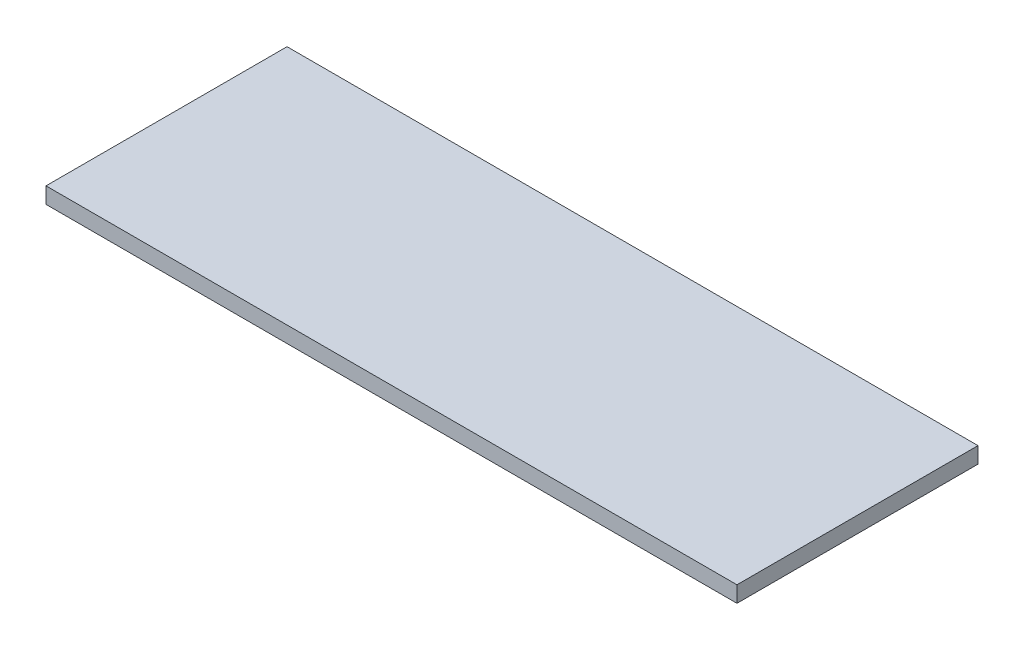
ISO-10303-21;
HEADER;
FILE_DESCRIPTION(('STEP AP214'),'2;1');
FILE_NAME('part.step','',(''),(''),'','','');
FILE_SCHEMA(('AUTOMOTIVE_DESIGN { 1 0 10303 214 1 1 1 1 }'));
ENDSEC;
DATA;
#1=APPLICATION_CONTEXT('core data for automotive mechanical design processes');
#2=APPLICATION_PROTOCOL_DEFINITION('international standard','automotive_design',2000,#1);
#3=PRODUCT_CONTEXT('',#1,'mechanical');
#4=PRODUCT('Part','Part','',(#3));
#5=PRODUCT_RELATED_PRODUCT_CATEGORY('part','',(#4));
#6=PRODUCT_DEFINITION_FORMATION('','',#4);
#7=PRODUCT_DEFINITION_CONTEXT('part definition',#1,'design');
#8=PRODUCT_DEFINITION('design','',#6,#7);
#9=PRODUCT_DEFINITION_SHAPE('','',#8);
#10=(LENGTH_UNIT() NAMED_UNIT(*) SI_UNIT(.MILLI.,.METRE.));
#11=(NAMED_UNIT(*) PLANE_ANGLE_UNIT() SI_UNIT($,.RADIAN.));
#12=(NAMED_UNIT(*) SI_UNIT($,.STERADIAN.) SOLID_ANGLE_UNIT());
#13=UNCERTAINTY_MEASURE_WITH_UNIT(LENGTH_MEASURE(1.E-05),#10,'distance_accuracy_value','');
#14=(GEOMETRIC_REPRESENTATION_CONTEXT(3) GLOBAL_UNCERTAINTY_ASSIGNED_CONTEXT((#13)) GLOBAL_UNIT_ASSIGNED_CONTEXT((#10,
#11,#12)) REPRESENTATION_CONTEXT('',''));
#15=CARTESIAN_POINT('',(0.,0.,0.));
#16=DIRECTION('',(0.,0.,1.));
#17=DIRECTION('',(1.,0.,0.));
#18=AXIS2_PLACEMENT_3D('',#15,#16,#17);
#19=CARTESIAN_POINT('',(215.,10.,75.));
#20=DIRECTION('',(-1.,0.,0.));
#21=DIRECTION('',(0.,0.,1.));
#22=AXIS2_PLACEMENT_3D('',#19,#20,#21);
#23=PLANE('',#22);
#24=DIRECTION('',(0.,0.,-1.));
#25=VECTOR('',#24,1.);
#26=CARTESIAN_POINT('',(215.,0.,75.));
#27=LINE('',#26,#25);
#28=CARTESIAN_POINT('',(215.,0.,75.));
#29=VERTEX_POINT('',#28);
#30=CARTESIAN_POINT('',(215.,0.,-75.));
#31=VERTEX_POINT('',#30);
#32=EDGE_CURVE('E98',#29,#31,#27,.T.);
#33=ORIENTED_EDGE('',*,*,#32,.T.);
#34=DIRECTION('',(0.,-1.,0.));
#35=VECTOR('',#34,1.);
#36=CARTESIAN_POINT('',(215.,10.,-75.));
#37=LINE('',#36,#35);
#38=CARTESIAN_POINT('',(215.,10.,-75.));
#39=VERTEX_POINT('',#38);
#40=EDGE_CURVE('E11',#39,#31,#37,.T.);
#41=ORIENTED_EDGE('',*,*,#40,.F.);
#42=DIRECTION('',(0.,0.,-1.));
#43=VECTOR('',#42,1.);
#44=CARTESIAN_POINT('',(215.,10.,75.));
#45=LINE('',#44,#43);
#46=CARTESIAN_POINT('',(215.,10.,75.));
#47=VERTEX_POINT('',#46);
#48=EDGE_CURVE('E86',#47,#39,#45,.T.);
#49=ORIENTED_EDGE('',*,*,#48,.F.);
#50=DIRECTION('',(0.,-1.,0.));
#51=VECTOR('',#50,1.);
#52=CARTESIAN_POINT('',(215.,10.,75.));
#53=LINE('',#52,#51);
#54=EDGE_CURVE('E94',#47,#29,#53,.T.);
#55=ORIENTED_EDGE('',*,*,#54,.T.);
#56=EDGE_LOOP('',(#33,#41,#49,#55));
#57=FACE_BOUND('',#56,.T.);
#58=ADVANCED_FACE('F35',(#57),#23,.F.);
#59=CARTESIAN_POINT('',(-215.,10.,-75.));
#60=DIRECTION('',(0.,0.,1.));
#61=DIRECTION('',(1.,0.,0.));
#62=AXIS2_PLACEMENT_3D('',#59,#60,#61);
#63=PLANE('',#62);
#64=DIRECTION('',(-1.,0.,0.));
#65=VECTOR('',#64,1.);
#66=CARTESIAN_POINT('',(-215.,0.,-75.));
#67=LINE('',#66,#65);
#68=CARTESIAN_POINT('',(-215.,0.,-75.));
#69=VERTEX_POINT('',#68);
#70=EDGE_CURVE('E90',#31,#69,#67,.T.);
#71=ORIENTED_EDGE('',*,*,#70,.T.);
#72=DIRECTION('',(0.,-1.,0.));
#73=VECTOR('',#72,1.);
#74=CARTESIAN_POINT('',(-215.,10.,-75.));
#75=LINE('',#74,#73);
#76=CARTESIAN_POINT('',(-215.,10.,-75.));
#77=VERTEX_POINT('',#76);
#78=EDGE_CURVE('E43',#77,#69,#75,.T.);
#79=ORIENTED_EDGE('',*,*,#78,.F.);
#80=DIRECTION('',(-1.,0.,0.));
#81=VECTOR('',#80,1.);
#82=CARTESIAN_POINT('',(-215.,10.,-75.));
#83=LINE('',#82,#81);
#84=EDGE_CURVE('E81',#39,#77,#83,.T.);
#85=ORIENTED_EDGE('',*,*,#84,.F.);
#86=ORIENTED_EDGE('',*,*,#40,.T.);
#87=EDGE_LOOP('',(#71,#79,#85,#86));
#88=FACE_BOUND('',#87,.T.);
#89=ADVANCED_FACE('F89',(#88),#63,.F.);
#90=CARTESIAN_POINT('',(-215.,10.,75.));
#91=DIRECTION('',(1.,0.,0.));
#92=DIRECTION('',(0.,0.,-1.));
#93=AXIS2_PLACEMENT_3D('',#90,#91,#92);
#94=PLANE('',#93);
#95=DIRECTION('',(0.,0.,1.));
#96=VECTOR('',#95,1.);
#97=CARTESIAN_POINT('',(-215.,0.,75.));
#98=LINE('',#97,#96);
#99=CARTESIAN_POINT('',(-215.,0.,75.));
#100=VERTEX_POINT('',#99);
#101=EDGE_CURVE('E68',#69,#100,#98,.T.);
#102=ORIENTED_EDGE('',*,*,#101,.T.);
#103=DIRECTION('',(0.,-1.,0.));
#104=VECTOR('',#103,1.);
#105=CARTESIAN_POINT('',(-215.,10.,75.));
#106=LINE('',#105,#104);
#107=CARTESIAN_POINT('',(-215.,10.,75.));
#108=VERTEX_POINT('',#107);
#109=EDGE_CURVE('E91',#108,#100,#106,.T.);
#110=ORIENTED_EDGE('',*,*,#109,.F.);
#111=DIRECTION('',(0.,0.,1.));
#112=VECTOR('',#111,1.);
#113=CARTESIAN_POINT('',(-215.,10.,75.));
#114=LINE('',#113,#112);
#115=EDGE_CURVE('E84',#77,#108,#114,.T.);
#116=ORIENTED_EDGE('',*,*,#115,.F.);
#117=ORIENTED_EDGE('',*,*,#78,.T.);
#118=EDGE_LOOP('',(#102,#110,#116,#117));
#119=FACE_BOUND('',#118,.T.);
#120=ADVANCED_FACE('F92',(#119),#94,.F.);
#121=CARTESIAN_POINT('',(-215.,10.,75.));
#122=DIRECTION('',(0.,0.,-1.));
#123=DIRECTION('',(-1.,0.,0.));
#124=AXIS2_PLACEMENT_3D('',#121,#122,#123);
#125=PLANE('',#124);
#126=DIRECTION('',(1.,0.,0.));
#127=VECTOR('',#126,1.);
#128=CARTESIAN_POINT('',(-215.,0.,75.));
#129=LINE('',#128,#127);
#130=EDGE_CURVE('E74',#100,#29,#129,.T.);
#131=ORIENTED_EDGE('',*,*,#130,.T.);
#132=ORIENTED_EDGE('',*,*,#54,.F.);
#133=DIRECTION('',(1.,0.,0.));
#134=VECTOR('',#133,1.);
#135=CARTESIAN_POINT('',(-215.,10.,75.));
#136=LINE('',#135,#134);
#137=EDGE_CURVE('E51',#108,#47,#136,.T.);
#138=ORIENTED_EDGE('',*,*,#137,.F.);
#139=ORIENTED_EDGE('',*,*,#109,.T.);
#140=EDGE_LOOP('',(#131,#132,#138,#139));
#141=FACE_BOUND('',#140,.T.);
#142=ADVANCED_FACE('F105',(#141),#125,.F.);
#143=CARTESIAN_POINT('',(0.,10.,0.));
#144=DIRECTION('',(0.,-1.,0.));
#145=DIRECTION('',(0.,0.,-1.));
#146=AXIS2_PLACEMENT_3D('',#143,#144,#145);
#147=PLANE('',#146);
#148=ORIENTED_EDGE('',*,*,#48,.T.);
#149=ORIENTED_EDGE('',*,*,#84,.T.);
#150=ORIENTED_EDGE('',*,*,#115,.T.);
#151=ORIENTED_EDGE('',*,*,#137,.T.);
#152=EDGE_LOOP('',(#148,#149,#150,#151));
#153=FACE_BOUND('',#152,.T.);
#154=ADVANCED_FACE('F82',(#153),#147,.F.);
#155=CARTESIAN_POINT('',(0.,0.,0.));
#156=DIRECTION('',(0.,-1.,0.));
#157=DIRECTION('',(0.,0.,-1.));
#158=AXIS2_PLACEMENT_3D('',#155,#156,#157);
#159=PLANE('',#158);
#160=ORIENTED_EDGE('',*,*,#32,.F.);
#161=ORIENTED_EDGE('',*,*,#130,.F.);
#162=ORIENTED_EDGE('',*,*,#101,.F.);
#163=ORIENTED_EDGE('',*,*,#70,.F.);
#164=EDGE_LOOP('',(#160,#161,#162,#163));
#165=FACE_BOUND('',#164,.T.);
#166=ADVANCED_FACE('F108',(#165),#159,.T.);
#167=CLOSED_SHELL('',(#58,#89,#120,#142,#154,#166));
#168=MANIFOLD_SOLID_BREP('B2',#167);
#169=ADVANCED_BREP_SHAPE_REPRESENTATION('',(#18,#168),#14);
#170=SHAPE_DEFINITION_REPRESENTATION(#9,#169);
ENDSEC;
END-ISO-10303-21;
